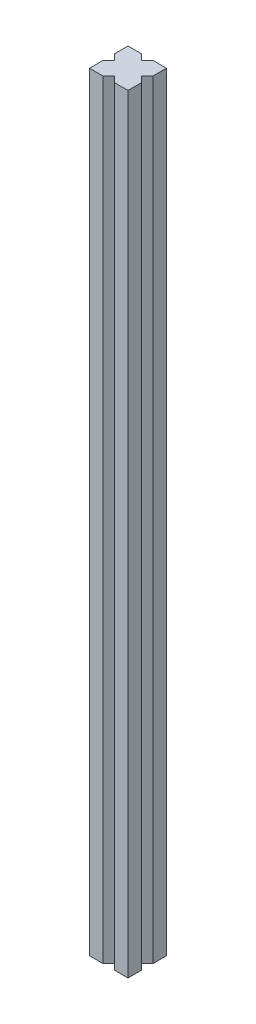
ISO-10303-21;
HEADER;
FILE_DESCRIPTION(('STEP AP214'),'2;1');
FILE_NAME('part.step','',(''),(''),'','','');
FILE_SCHEMA(('AUTOMOTIVE_DESIGN { 1 0 10303 214 1 1 1 1 }'));
ENDSEC;
DATA;
#1=APPLICATION_CONTEXT('core data for automotive mechanical design processes');
#2=APPLICATION_PROTOCOL_DEFINITION('international standard','automotive_design',2000,#1);
#3=PRODUCT_CONTEXT('',#1,'mechanical');
#4=PRODUCT('Part','Part','',(#3));
#5=PRODUCT_RELATED_PRODUCT_CATEGORY('part','',(#4));
#6=PRODUCT_DEFINITION_FORMATION('','',#4);
#7=PRODUCT_DEFINITION_CONTEXT('part definition',#1,'design');
#8=PRODUCT_DEFINITION('design','',#6,#7);
#9=PRODUCT_DEFINITION_SHAPE('','',#8);
#10=(LENGTH_UNIT() NAMED_UNIT(*) SI_UNIT(.MILLI.,.METRE.));
#11=(NAMED_UNIT(*) PLANE_ANGLE_UNIT() SI_UNIT($,.RADIAN.));
#12=(NAMED_UNIT(*) SI_UNIT($,.STERADIAN.) SOLID_ANGLE_UNIT());
#13=UNCERTAINTY_MEASURE_WITH_UNIT(LENGTH_MEASURE(1.E-05),#10,'distance_accuracy_value','');
#14=(GEOMETRIC_REPRESENTATION_CONTEXT(3) GLOBAL_UNCERTAINTY_ASSIGNED_CONTEXT((#13)) GLOBAL_UNIT_ASSIGNED_CONTEXT((#10,
#11,#12)) REPRESENTATION_CONTEXT('',''));
#15=CARTESIAN_POINT('',(0.,0.,0.));
#16=DIRECTION('',(0.,0.,1.));
#17=DIRECTION('',(1.,0.,0.));
#18=AXIS2_PLACEMENT_3D('',#15,#16,#17);
#19=CARTESIAN_POINT('',(20.,400.,0.));
#20=DIRECTION('',(0.,0.,-1.));
#21=DIRECTION('',(-1.,0.,0.));
#22=AXIS2_PLACEMENT_3D('',#19,#20,#21);
#23=PLANE('',#22);
#24=DIRECTION('',(1.,0.,0.));
#25=VECTOR('',#24,1.);
#26=CARTESIAN_POINT('',(20.,0.,0.));
#27=LINE('',#26,#25);
#28=CARTESIAN_POINT('',(0.,0.,0.));
#29=VERTEX_POINT('',#28);
#30=CARTESIAN_POINT('',(7.,0.,0.));
#31=VERTEX_POINT('',#30);
#32=EDGE_CURVE('E289',#29,#31,#27,.T.);
#33=ORIENTED_EDGE('',*,*,#32,.T.);
#34=DIRECTION('',(0.,1.,0.));
#35=VECTOR('',#34,1.);
#36=CARTESIAN_POINT('',(7.,0.,0.));
#37=LINE('',#36,#35);
#38=CARTESIAN_POINT('',(7.,400.,0.));
#39=VERTEX_POINT('',#38);
#40=EDGE_CURVE('E266',#31,#39,#37,.T.);
#41=ORIENTED_EDGE('',*,*,#40,.T.);
#42=DIRECTION('',(1.,0.,0.));
#43=VECTOR('',#42,1.);
#44=CARTESIAN_POINT('',(20.,400.,0.));
#45=LINE('',#44,#43);
#46=CARTESIAN_POINT('',(0.,400.,0.));
#47=VERTEX_POINT('',#46);
#48=EDGE_CURVE('E279',#47,#39,#45,.T.);
#49=ORIENTED_EDGE('',*,*,#48,.F.);
#50=DIRECTION('',(0.,-1.,0.));
#51=VECTOR('',#50,1.);
#52=CARTESIAN_POINT('',(0.,400.,0.));
#53=LINE('',#52,#51);
#54=EDGE_CURVE('E184',#47,#29,#53,.T.);
#55=ORIENTED_EDGE('',*,*,#54,.T.);
#56=EDGE_LOOP('',(#33,#41,#49,#55));
#57=FACE_BOUND('',#56,.T.);
#58=ADVANCED_FACE('F34',(#57),#23,.F.);
#59=CARTESIAN_POINT('',(20.,400.,-20.));
#60=DIRECTION('',(-1.,0.,0.));
#61=DIRECTION('',(0.,0.,1.));
#62=AXIS2_PLACEMENT_3D('',#59,#60,#61);
#63=PLANE('',#62);
#64=DIRECTION('',(0.,0.,-1.));
#65=VECTOR('',#64,1.);
#66=CARTESIAN_POINT('',(20.,0.,-20.));
#67=LINE('',#66,#65);
#68=CARTESIAN_POINT('',(20.,0.,0.));
#69=VERTEX_POINT('',#68);
#70=CARTESIAN_POINT('',(20.,0.,-7.));
#71=VERTEX_POINT('',#70);
#72=EDGE_CURVE('E173',#69,#71,#67,.T.);
#73=ORIENTED_EDGE('',*,*,#72,.T.);
#74=DIRECTION('',(0.,1.,0.));
#75=VECTOR('',#74,1.);
#76=CARTESIAN_POINT('',(20.,0.,-7.));
#77=LINE('',#76,#75);
#78=CARTESIAN_POINT('',(20.,400.,-7.));
#79=VERTEX_POINT('',#78);
#80=EDGE_CURVE('E212',#71,#79,#77,.T.);
#81=ORIENTED_EDGE('',*,*,#80,.T.);
#82=DIRECTION('',(0.,0.,-1.));
#83=VECTOR('',#82,1.);
#84=CARTESIAN_POINT('',(20.,400.,-20.));
#85=LINE('',#84,#83);
#86=CARTESIAN_POINT('',(20.,400.,0.));
#87=VERTEX_POINT('',#86);
#88=EDGE_CURVE('E283',#87,#79,#85,.T.);
#89=ORIENTED_EDGE('',*,*,#88,.F.);
#90=DIRECTION('',(0.,-1.,0.));
#91=VECTOR('',#90,1.);
#92=CARTESIAN_POINT('',(20.,400.,0.));
#93=LINE('',#92,#91);
#94=EDGE_CURVE('E11',#87,#69,#93,.T.);
#95=ORIENTED_EDGE('',*,*,#94,.T.);
#96=EDGE_LOOP('',(#73,#81,#89,#95));
#97=FACE_BOUND('',#96,.T.);
#98=ADVANCED_FACE('F301',(#97),#63,.F.);
#99=CARTESIAN_POINT('',(0.,400.,-20.));
#100=DIRECTION('',(0.,0.,1.));
#101=DIRECTION('',(1.,0.,0.));
#102=AXIS2_PLACEMENT_3D('',#99,#100,#101);
#103=PLANE('',#102);
#104=DIRECTION('',(-1.,0.,0.));
#105=VECTOR('',#104,1.);
#106=CARTESIAN_POINT('',(0.,0.,-20.));
#107=LINE('',#106,#105);
#108=CARTESIAN_POINT('',(20.,0.,-20.));
#109=VERTEX_POINT('',#108);
#110=CARTESIAN_POINT('',(13.,0.,-20.));
#111=VERTEX_POINT('',#110);
#112=EDGE_CURVE('E172',#109,#111,#107,.T.);
#113=ORIENTED_EDGE('',*,*,#112,.T.);
#114=DIRECTION('',(0.,1.,0.));
#115=VECTOR('',#114,1.);
#116=CARTESIAN_POINT('',(13.,0.,-20.));
#117=LINE('',#116,#115);
#118=CARTESIAN_POINT('',(13.,400.,-20.));
#119=VERTEX_POINT('',#118);
#120=EDGE_CURVE('E215',#111,#119,#117,.T.);
#121=ORIENTED_EDGE('',*,*,#120,.T.);
#122=DIRECTION('',(-1.,0.,0.));
#123=VECTOR('',#122,1.);
#124=CARTESIAN_POINT('',(0.,400.,-20.));
#125=LINE('',#124,#123);
#126=CARTESIAN_POINT('',(20.,400.,-20.));
#127=VERTEX_POINT('',#126);
#128=EDGE_CURVE('E202',#127,#119,#125,.T.);
#129=ORIENTED_EDGE('',*,*,#128,.F.);
#130=DIRECTION('',(0.,-1.,0.));
#131=VECTOR('',#130,1.);
#132=CARTESIAN_POINT('',(20.,400.,-20.));
#133=LINE('',#132,#131);
#134=EDGE_CURVE('E43',#127,#109,#133,.T.);
#135=ORIENTED_EDGE('',*,*,#134,.T.);
#136=EDGE_LOOP('',(#113,#121,#129,#135));
#137=FACE_BOUND('',#136,.T.);
#138=ADVANCED_FACE('F199',(#137),#103,.F.);
#139=CARTESIAN_POINT('',(0.,400.,0.));
#140=DIRECTION('',(1.,0.,0.));
#141=DIRECTION('',(0.,0.,-1.));
#142=AXIS2_PLACEMENT_3D('',#139,#140,#141);
#143=PLANE('',#142);
#144=DIRECTION('',(0.,0.,1.));
#145=VECTOR('',#144,1.);
#146=CARTESIAN_POINT('',(0.,400.,0.));
#147=LINE('',#146,#145);
#148=CARTESIAN_POINT('',(0.,400.,-7.));
#149=VERTEX_POINT('',#148);
#150=EDGE_CURVE('E287',#149,#47,#147,.T.);
#151=ORIENTED_EDGE('',*,*,#150,.F.);
#152=DIRECTION('',(0.,1.,0.));
#153=VECTOR('',#152,1.);
#154=CARTESIAN_POINT('',(0.,0.,-7.));
#155=LINE('',#154,#153);
#156=CARTESIAN_POINT('',(0.,0.,-7.));
#157=VERTEX_POINT('',#156);
#158=EDGE_CURVE('E229',#157,#149,#155,.T.);
#159=ORIENTED_EDGE('',*,*,#158,.F.);
#160=DIRECTION('',(0.,0.,1.));
#161=VECTOR('',#160,1.);
#162=CARTESIAN_POINT('',(0.,0.,0.));
#163=LINE('',#162,#161);
#164=EDGE_CURVE('E176',#157,#29,#163,.T.);
#165=ORIENTED_EDGE('',*,*,#164,.T.);
#166=ORIENTED_EDGE('',*,*,#54,.F.);
#167=EDGE_LOOP('',(#151,#159,#165,#166));
#168=FACE_BOUND('',#167,.T.);
#169=ADVANCED_FACE('F321',(#168),#143,.F.);
#170=CARTESIAN_POINT('',(13.,400.,0.));
#171=VERTEX_POINT('',#170);
#172=EDGE_CURVE('E183',#171,#87,#45,.T.);
#173=ORIENTED_EDGE('',*,*,#172,.F.);
#174=DIRECTION('',(0.,1.,0.));
#175=VECTOR('',#174,1.);
#176=CARTESIAN_POINT('',(13.,0.,0.));
#177=LINE('',#176,#175);
#178=CARTESIAN_POINT('',(13.,0.,0.));
#179=VERTEX_POINT('',#178);
#180=EDGE_CURVE('E273',#179,#171,#177,.T.);
#181=ORIENTED_EDGE('',*,*,#180,.F.);
#182=EDGE_CURVE('E218',#179,#69,#27,.T.);
#183=ORIENTED_EDGE('',*,*,#182,.T.);
#184=ORIENTED_EDGE('',*,*,#94,.F.);
#185=EDGE_LOOP('',(#173,#181,#183,#184));
#186=FACE_BOUND('',#185,.T.);
#187=ADVANCED_FACE('F36',(#186),#23,.F.);
#188=CARTESIAN_POINT('',(20.,400.,-13.));
#189=VERTEX_POINT('',#188);
#190=EDGE_CURVE('E282',#189,#127,#85,.T.);
#191=ORIENTED_EDGE('',*,*,#190,.F.);
#192=DIRECTION('',(0.,1.,0.));
#193=VECTOR('',#192,1.);
#194=CARTESIAN_POINT('',(20.,0.,-13.));
#195=LINE('',#194,#193);
#196=CARTESIAN_POINT('',(20.,0.,-13.));
#197=VERTEX_POINT('',#196);
#198=EDGE_CURVE('E225',#197,#189,#195,.T.);
#199=ORIENTED_EDGE('',*,*,#198,.F.);
#200=EDGE_CURVE('E178',#197,#109,#67,.T.);
#201=ORIENTED_EDGE('',*,*,#200,.T.);
#202=ORIENTED_EDGE('',*,*,#134,.F.);
#203=EDGE_LOOP('',(#191,#199,#201,#202));
#204=FACE_BOUND('',#203,.T.);
#205=ADVANCED_FACE('F365',(#204),#63,.F.);
#206=CARTESIAN_POINT('',(7.00000000000001,400.,-20.));
#207=VERTEX_POINT('',#206);
#208=CARTESIAN_POINT('',(0.,400.,-20.));
#209=VERTEX_POINT('',#208);
#210=EDGE_CURVE('E164',#207,#209,#125,.T.);
#211=ORIENTED_EDGE('',*,*,#210,.F.);
#212=DIRECTION('',(0.,1.,0.));
#213=VECTOR('',#212,1.);
#214=CARTESIAN_POINT('',(7.00000000000001,0.,-20.));
#215=LINE('',#214,#213);
#216=CARTESIAN_POINT('',(7.00000000000001,0.,-20.));
#217=VERTEX_POINT('',#216);
#218=EDGE_CURVE('E151',#217,#207,#215,.T.);
#219=ORIENTED_EDGE('',*,*,#218,.F.);
#220=CARTESIAN_POINT('',(0.,0.,-20.));
#221=VERTEX_POINT('',#220);
#222=EDGE_CURVE('E162',#217,#221,#107,.T.);
#223=ORIENTED_EDGE('',*,*,#222,.T.);
#224=DIRECTION('',(0.,-1.,0.));
#225=VECTOR('',#224,1.);
#226=CARTESIAN_POINT('',(0.,400.,-20.));
#227=LINE('',#226,#225);
#228=EDGE_CURVE('E188',#209,#221,#227,.T.);
#229=ORIENTED_EDGE('',*,*,#228,.F.);
#230=EDGE_LOOP('',(#211,#219,#223,#229));
#231=FACE_BOUND('',#230,.T.);
#232=ADVANCED_FACE('F160',(#231),#103,.F.);
#233=CARTESIAN_POINT('',(0.,0.,-13.));
#234=VERTEX_POINT('',#233);
#235=EDGE_CURVE('E171',#221,#234,#163,.T.);
#236=ORIENTED_EDGE('',*,*,#235,.T.);
#237=DIRECTION('',(0.,1.,0.));
#238=VECTOR('',#237,1.);
#239=CARTESIAN_POINT('',(0.,0.,-13.));
#240=LINE('',#239,#238);
#241=CARTESIAN_POINT('',(0.,400.,-13.));
#242=VERTEX_POINT('',#241);
#243=EDGE_CURVE('E253',#234,#242,#240,.T.);
#244=ORIENTED_EDGE('',*,*,#243,.T.);
#245=EDGE_CURVE('E189',#209,#242,#147,.T.);
#246=ORIENTED_EDGE('',*,*,#245,.F.);
#247=ORIENTED_EDGE('',*,*,#228,.T.);
#248=EDGE_LOOP('',(#236,#244,#246,#247));
#249=FACE_BOUND('',#248,.T.);
#250=ADVANCED_FACE('F329',(#249),#143,.F.);
#251=CARTESIAN_POINT('',(0.,400.,0.));
#252=DIRECTION('',(0.,-1.,0.));
#253=DIRECTION('',(0.,0.,-1.));
#254=AXIS2_PLACEMENT_3D('',#251,#252,#253);
#255=PLANE('',#254);
#256=ORIENTED_EDGE('',*,*,#128,.T.);
#257=DIRECTION('',(0.707106781186548,0.,-0.707106781186547));
#258=VECTOR('',#257,1.);
#259=CARTESIAN_POINT('',(13.,400.,-20.));
#260=LINE('',#259,#258);
#261=CARTESIAN_POINT('',(10.,400.,-17.));
#262=VERTEX_POINT('',#261);
#263=EDGE_CURVE('E156',#262,#119,#260,.T.);
#264=ORIENTED_EDGE('',*,*,#263,.F.);
#265=DIRECTION('',(0.707106781186547,0.,0.707106781186548));
#266=VECTOR('',#265,1.);
#267=CARTESIAN_POINT('',(7.00000000000001,400.,-20.));
#268=LINE('',#267,#266);
#269=EDGE_CURVE('E209',#207,#262,#268,.T.);
#270=ORIENTED_EDGE('',*,*,#269,.F.);
#271=ORIENTED_EDGE('',*,*,#210,.T.);
#272=ORIENTED_EDGE('',*,*,#245,.T.);
#273=DIRECTION('',(-0.707106781186548,0.,-0.707106781186547));
#274=VECTOR('',#273,1.);
#275=CARTESIAN_POINT('',(0.,400.,-13.));
#276=LINE('',#275,#274);
#277=CARTESIAN_POINT('',(3.00000000000001,400.,-10.));
#278=VERTEX_POINT('',#277);
#279=EDGE_CURVE('E243',#278,#242,#276,.T.);
#280=ORIENTED_EDGE('',*,*,#279,.F.);
#281=DIRECTION('',(0.707106781186547,0.,-0.707106781186547));
#282=VECTOR('',#281,1.);
#283=CARTESIAN_POINT('',(0.,400.,-7.));
#284=LINE('',#283,#282);
#285=EDGE_CURVE('E246',#149,#278,#284,.T.);
#286=ORIENTED_EDGE('',*,*,#285,.F.);
#287=ORIENTED_EDGE('',*,*,#150,.T.);
#288=ORIENTED_EDGE('',*,*,#48,.T.);
#289=DIRECTION('',(-0.707106781186546,0.,0.707106781186549));
#290=VECTOR('',#289,1.);
#291=CARTESIAN_POINT('',(7.,400.,0.));
#292=LINE('',#291,#290);
#293=CARTESIAN_POINT('',(10.,400.,-3.00000000000001));
#294=VERTEX_POINT('',#293);
#295=EDGE_CURVE('E267',#294,#39,#292,.T.);
#296=ORIENTED_EDGE('',*,*,#295,.F.);
#297=DIRECTION('',(-0.707106781186547,0.,-0.707106781186548));
#298=VECTOR('',#297,1.);
#299=CARTESIAN_POINT('',(13.,400.,0.));
#300=LINE('',#299,#298);
#301=EDGE_CURVE('E263',#171,#294,#300,.T.);
#302=ORIENTED_EDGE('',*,*,#301,.F.);
#303=ORIENTED_EDGE('',*,*,#172,.T.);
#304=ORIENTED_EDGE('',*,*,#88,.T.);
#305=DIRECTION('',(0.707106781186548,0.,0.707106781186547));
#306=VECTOR('',#305,1.);
#307=CARTESIAN_POINT('',(20.,400.,-7.));
#308=LINE('',#307,#306);
#309=CARTESIAN_POINT('',(17.,400.,-10.));
#310=VERTEX_POINT('',#309);
#311=EDGE_CURVE('E223',#310,#79,#308,.T.);
#312=ORIENTED_EDGE('',*,*,#311,.F.);
#313=DIRECTION('',(-0.707106781186549,0.,0.707106781186546));
#314=VECTOR('',#313,1.);
#315=CARTESIAN_POINT('',(20.,400.,-13.));
#316=LINE('',#315,#314);
#317=EDGE_CURVE('E226',#189,#310,#316,.T.);
#318=ORIENTED_EDGE('',*,*,#317,.F.);
#319=ORIENTED_EDGE('',*,*,#190,.T.);
#320=EDGE_LOOP('',(#256,#264,#270,#271,#272,#280,#286,#287,#288,#296,#302,#303,#304,#312,#318,#319));
#321=FACE_BOUND('',#320,.T.);
#322=ADVANCED_FACE('F304',(#321),#255,.F.);
#323=CARTESIAN_POINT('',(0.,0.,0.));
#324=DIRECTION('',(0.,-1.,0.));
#325=DIRECTION('',(0.,0.,-1.));
#326=AXIS2_PLACEMENT_3D('',#323,#324,#325);
#327=PLANE('',#326);
#328=DIRECTION('',(0.707106781186548,0.,-0.707106781186547));
#329=VECTOR('',#328,1.);
#330=CARTESIAN_POINT('',(13.,0.,-20.));
#331=LINE('',#330,#329);
#332=CARTESIAN_POINT('',(10.,0.,-17.));
#333=VERTEX_POINT('',#332);
#334=EDGE_CURVE('E50',#333,#111,#331,.T.);
#335=ORIENTED_EDGE('',*,*,#334,.T.);
#336=ORIENTED_EDGE('',*,*,#112,.F.);
#337=ORIENTED_EDGE('',*,*,#200,.F.);
#338=DIRECTION('',(-0.707106781186549,0.,0.707106781186546));
#339=VECTOR('',#338,1.);
#340=CARTESIAN_POINT('',(20.,0.,-13.));
#341=LINE('',#340,#339);
#342=CARTESIAN_POINT('',(17.,0.,-10.));
#343=VERTEX_POINT('',#342);
#344=EDGE_CURVE('E221',#197,#343,#341,.T.);
#345=ORIENTED_EDGE('',*,*,#344,.T.);
#346=DIRECTION('',(0.707106781186548,0.,0.707106781186547));
#347=VECTOR('',#346,1.);
#348=CARTESIAN_POINT('',(20.,0.,-7.));
#349=LINE('',#348,#347);
#350=EDGE_CURVE('E58',#343,#71,#349,.T.);
#351=ORIENTED_EDGE('',*,*,#350,.T.);
#352=ORIENTED_EDGE('',*,*,#72,.F.);
#353=ORIENTED_EDGE('',*,*,#182,.F.);
#354=DIRECTION('',(-0.707106781186547,0.,-0.707106781186548));
#355=VECTOR('',#354,1.);
#356=CARTESIAN_POINT('',(13.,0.,0.));
#357=LINE('',#356,#355);
#358=CARTESIAN_POINT('',(10.,0.,-3.00000000000001));
#359=VERTEX_POINT('',#358);
#360=EDGE_CURVE('E262',#179,#359,#357,.T.);
#361=ORIENTED_EDGE('',*,*,#360,.T.);
#362=DIRECTION('',(-0.707106781186546,0.,0.707106781186549));
#363=VECTOR('',#362,1.);
#364=CARTESIAN_POINT('',(7.,0.,0.));
#365=LINE('',#364,#363);
#366=EDGE_CURVE('E259',#359,#31,#365,.T.);
#367=ORIENTED_EDGE('',*,*,#366,.T.);
#368=ORIENTED_EDGE('',*,*,#32,.F.);
#369=ORIENTED_EDGE('',*,*,#164,.F.);
#370=DIRECTION('',(0.707106781186547,0.,-0.707106781186547));
#371=VECTOR('',#370,1.);
#372=CARTESIAN_POINT('',(0.,0.,-7.));
#373=LINE('',#372,#371);
#374=CARTESIAN_POINT('',(3.00000000000001,0.,-10.));
#375=VERTEX_POINT('',#374);
#376=EDGE_CURVE('E239',#157,#375,#373,.T.);
#377=ORIENTED_EDGE('',*,*,#376,.T.);
#378=DIRECTION('',(-0.707106781186548,0.,-0.707106781186547));
#379=VECTOR('',#378,1.);
#380=CARTESIAN_POINT('',(0.,0.,-13.));
#381=LINE('',#380,#379);
#382=EDGE_CURVE('E242',#375,#234,#381,.T.);
#383=ORIENTED_EDGE('',*,*,#382,.T.);
#384=ORIENTED_EDGE('',*,*,#235,.F.);
#385=ORIENTED_EDGE('',*,*,#222,.F.);
#386=DIRECTION('',(0.707106781186547,0.,0.707106781186548));
#387=VECTOR('',#386,1.);
#388=CARTESIAN_POINT('',(7.00000000000001,0.,-20.));
#389=LINE('',#388,#387);
#390=EDGE_CURVE('E147',#217,#333,#389,.T.);
#391=ORIENTED_EDGE('',*,*,#390,.T.);
#392=EDGE_LOOP('',(#335,#336,#337,#345,#351,#352,#353,#361,#367,#368,#369,#377,#383,#384,#385,#391));
#393=FACE_BOUND('',#392,.T.);
#394=ADVANCED_FACE('F168',(#393),#327,.T.);
#395=CARTESIAN_POINT('',(7.,0.,0.));
#396=DIRECTION('',(-0.707106781186549,0.,-0.707106781186546));
#397=DIRECTION('',(-0.707106781186546,0.,0.707106781186549));
#398=AXIS2_PLACEMENT_3D('',#395,#396,#397);
#399=PLANE('',#398);
#400=ORIENTED_EDGE('',*,*,#295,.T.);
#401=ORIENTED_EDGE('',*,*,#40,.F.);
#402=ORIENTED_EDGE('',*,*,#366,.F.);
#403=DIRECTION('',(0.,1.,0.));
#404=VECTOR('',#403,1.);
#405=CARTESIAN_POINT('',(10.,0.,-3.00000000000001));
#406=LINE('',#405,#404);
#407=EDGE_CURVE('E249',#359,#294,#406,.T.);
#408=ORIENTED_EDGE('',*,*,#407,.T.);
#409=EDGE_LOOP('',(#400,#401,#402,#408));
#410=FACE_BOUND('',#409,.T.);
#411=ADVANCED_FACE('F313',(#410),#399,.F.);
#412=CARTESIAN_POINT('',(13.,0.,0.));
#413=DIRECTION('',(0.707106781186548,0.,-0.707106781186547));
#414=DIRECTION('',(-0.707106781186547,0.,-0.707106781186548));
#415=AXIS2_PLACEMENT_3D('',#412,#413,#414);
#416=PLANE('',#415);
#417=ORIENTED_EDGE('',*,*,#301,.T.);
#418=ORIENTED_EDGE('',*,*,#407,.F.);
#419=ORIENTED_EDGE('',*,*,#360,.F.);
#420=ORIENTED_EDGE('',*,*,#180,.T.);
#421=EDGE_LOOP('',(#417,#418,#419,#420));
#422=FACE_BOUND('',#421,.T.);
#423=ADVANCED_FACE('F310',(#422),#416,.F.);
#424=CARTESIAN_POINT('',(0.,0.,-7.));
#425=DIRECTION('',(0.707106781186547,0.,0.707106781186547));
#426=DIRECTION('',(0.707106781186548,0.,-0.707106781186548));
#427=AXIS2_PLACEMENT_3D('',#424,#425,#426);
#428=PLANE('',#427);
#429=ORIENTED_EDGE('',*,*,#285,.T.);
#430=DIRECTION('',(0.,1.,0.));
#431=VECTOR('',#430,1.);
#432=CARTESIAN_POINT('',(3.00000000000001,0.,-10.));
#433=LINE('',#432,#431);
#434=EDGE_CURVE('E245',#375,#278,#433,.T.);
#435=ORIENTED_EDGE('',*,*,#434,.F.);
#436=ORIENTED_EDGE('',*,*,#376,.F.);
#437=ORIENTED_EDGE('',*,*,#158,.T.);
#438=EDGE_LOOP('',(#429,#435,#436,#437));
#439=FACE_BOUND('',#438,.T.);
#440=ADVANCED_FACE('F324',(#439),#428,.F.);
#441=CARTESIAN_POINT('',(0.,0.,-13.));
#442=DIRECTION('',(0.707106781186547,0.,-0.707106781186548));
#443=DIRECTION('',(-0.707106781186548,0.,-0.707106781186547));
#444=AXIS2_PLACEMENT_3D('',#441,#442,#443);
#445=PLANE('',#444);
#446=ORIENTED_EDGE('',*,*,#279,.T.);
#447=ORIENTED_EDGE('',*,*,#243,.F.);
#448=ORIENTED_EDGE('',*,*,#382,.F.);
#449=ORIENTED_EDGE('',*,*,#434,.T.);
#450=EDGE_LOOP('',(#446,#447,#448,#449));
#451=FACE_BOUND('',#450,.T.);
#452=ADVANCED_FACE('F326',(#451),#445,.F.);
#453=CARTESIAN_POINT('',(20.,0.,-7.));
#454=DIRECTION('',(-0.707106781186547,0.,0.707106781186548));
#455=DIRECTION('',(0.707106781186548,0.,0.707106781186547));
#456=AXIS2_PLACEMENT_3D('',#453,#454,#455);
#457=PLANE('',#456);
#458=ORIENTED_EDGE('',*,*,#311,.T.);
#459=ORIENTED_EDGE('',*,*,#80,.F.);
#460=ORIENTED_EDGE('',*,*,#350,.F.);
#461=DIRECTION('',(0.,1.,0.));
#462=VECTOR('',#461,1.);
#463=CARTESIAN_POINT('',(17.,0.,-10.));
#464=LINE('',#463,#462);
#465=EDGE_CURVE('E234',#343,#310,#464,.T.);
#466=ORIENTED_EDGE('',*,*,#465,.T.);
#467=EDGE_LOOP('',(#458,#459,#460,#466));
#468=FACE_BOUND('',#467,.T.);
#469=ADVANCED_FACE('F417',(#468),#457,.F.);
#470=CARTESIAN_POINT('',(20.,0.,-13.));
#471=DIRECTION('',(-0.707106781186546,0.,-0.707106781186549));
#472=DIRECTION('',(-0.707106781186549,0.,0.707106781186546));
#473=AXIS2_PLACEMENT_3D('',#470,#471,#472);
#474=PLANE('',#473);
#475=ORIENTED_EDGE('',*,*,#317,.T.);
#476=ORIENTED_EDGE('',*,*,#465,.F.);
#477=ORIENTED_EDGE('',*,*,#344,.F.);
#478=ORIENTED_EDGE('',*,*,#198,.T.);
#479=EDGE_LOOP('',(#475,#476,#477,#478));
#480=FACE_BOUND('',#479,.T.);
#481=ADVANCED_FACE('F424',(#480),#474,.F.);
#482=CARTESIAN_POINT('',(13.,0.,-20.));
#483=DIRECTION('',(0.707106781186547,0.,0.707106781186548));
#484=DIRECTION('',(0.707106781186548,0.,-0.707106781186547));
#485=AXIS2_PLACEMENT_3D('',#482,#483,#484);
#486=PLANE('',#485);
#487=ORIENTED_EDGE('',*,*,#263,.T.);
#488=ORIENTED_EDGE('',*,*,#120,.F.);
#489=ORIENTED_EDGE('',*,*,#334,.F.);
#490=DIRECTION('',(0.,1.,0.));
#491=VECTOR('',#490,1.);
#492=CARTESIAN_POINT('',(10.,0.,-17.));
#493=LINE('',#492,#491);
#494=EDGE_CURVE('E153',#333,#262,#493,.T.);
#495=ORIENTED_EDGE('',*,*,#494,.T.);
#496=EDGE_LOOP('',(#487,#488,#489,#495));
#497=FACE_BOUND('',#496,.T.);
#498=ADVANCED_FACE('F431',(#497),#486,.F.);
#499=CARTESIAN_POINT('',(7.00000000000001,0.,-20.));
#500=DIRECTION('',(-0.707106781186548,0.,0.707106781186547));
#501=DIRECTION('',(0.707106781186547,0.,0.707106781186548));
#502=AXIS2_PLACEMENT_3D('',#499,#500,#501);
#503=PLANE('',#502);
#504=ORIENTED_EDGE('',*,*,#269,.T.);
#505=ORIENTED_EDGE('',*,*,#494,.F.);
#506=ORIENTED_EDGE('',*,*,#390,.F.);
#507=ORIENTED_EDGE('',*,*,#218,.T.);
#508=EDGE_LOOP('',(#504,#505,#506,#507));
#509=FACE_BOUND('',#508,.T.);
#510=ADVANCED_FACE('F150',(#509),#503,.F.);
#511=CLOSED_SHELL('',(#58,#98,#138,#169,#187,#205,#232,#250,#322,#394,#411,#423,#440,#452,#469,
#481,#498,#510));
#512=MANIFOLD_SOLID_BREP('B2',#511);
#513=ADVANCED_BREP_SHAPE_REPRESENTATION('',(#18,#512),#14);
#514=SHAPE_DEFINITION_REPRESENTATION(#9,#513);
ENDSEC;
END-ISO-10303-21;
